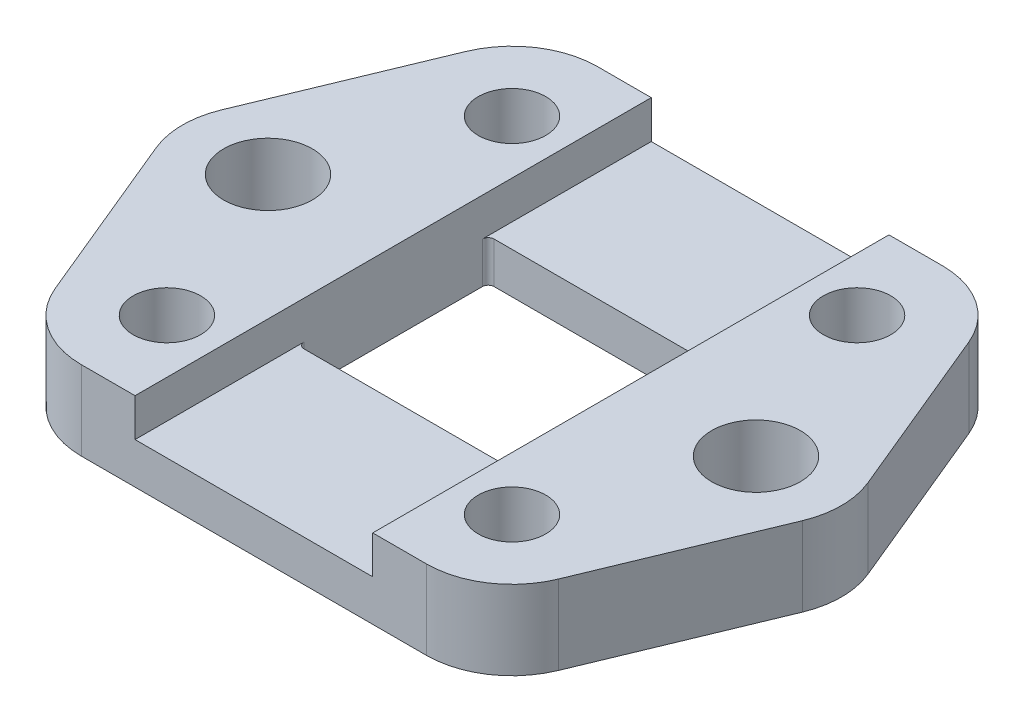
ISO-10303-21;
HEADER;
FILE_DESCRIPTION(('STEP AP214'),'2;1');
FILE_NAME('part.step','',(''),(''),'','','');
FILE_SCHEMA(('AUTOMOTIVE_DESIGN { 1 0 10303 214 1 1 1 1 }'));
ENDSEC;
DATA;
#1=APPLICATION_CONTEXT('core data for automotive mechanical design processes');
#2=APPLICATION_PROTOCOL_DEFINITION('international standard','automotive_design',2000,#1);
#3=PRODUCT_CONTEXT('',#1,'mechanical');
#4=PRODUCT('Part','Part','',(#3));
#5=PRODUCT_RELATED_PRODUCT_CATEGORY('part','',(#4));
#6=PRODUCT_DEFINITION_FORMATION('','',#4);
#7=PRODUCT_DEFINITION_CONTEXT('part definition',#1,'design');
#8=PRODUCT_DEFINITION('design','',#6,#7);
#9=PRODUCT_DEFINITION_SHAPE('','',#8);
#10=(LENGTH_UNIT() NAMED_UNIT(*) SI_UNIT(.MILLI.,.METRE.));
#11=(NAMED_UNIT(*) PLANE_ANGLE_UNIT() SI_UNIT($,.RADIAN.));
#12=(NAMED_UNIT(*) SI_UNIT($,.STERADIAN.) SOLID_ANGLE_UNIT());
#13=UNCERTAINTY_MEASURE_WITH_UNIT(LENGTH_MEASURE(1.E-05),#10,'distance_accuracy_value','');
#14=(GEOMETRIC_REPRESENTATION_CONTEXT(3) GLOBAL_UNCERTAINTY_ASSIGNED_CONTEXT((#13)) GLOBAL_UNIT_ASSIGNED_CONTEXT((#10,
#11,#12)) REPRESENTATION_CONTEXT('',''));
#15=CARTESIAN_POINT('',(0.,0.,0.));
#16=DIRECTION('',(0.,0.,1.));
#17=DIRECTION('',(1.,0.,0.));
#18=AXIS2_PLACEMENT_3D('',#15,#16,#17);
#19=CARTESIAN_POINT('',(0.,1.651,0.));
#20=DIRECTION('',(0.,1.,0.));
#21=DIRECTION('',(0.,0.,1.));
#22=AXIS2_PLACEMENT_3D('',#19,#20,#21);
#23=PLANE('',#22);
#24=DIRECTION('',(-1.,0.,0.));
#25=VECTOR('',#24,1.);
#26=CARTESIAN_POINT('',(9.2058356335816,1.651,-10.3441500000008));
#27=LINE('',#26,#25);
#28=CARTESIAN_POINT('',(4.7625,1.651,-10.3441500000008));
#29=VERTEX_POINT('',#28);
#30=CARTESIAN_POINT('',(-4.7625,1.651,-10.3441500000008));
#31=VERTEX_POINT('',#30);
#32=EDGE_CURVE('E254',#29,#31,#27,.T.);
#33=ORIENTED_EDGE('',*,*,#32,.T.);
#34=DIRECTION('',(0.,0.,-1.));
#35=VECTOR('',#34,1.);
#36=CARTESIAN_POINT('',(-4.7625,1.651,-10.3441500000008));
#37=LINE('',#36,#35);
#38=CARTESIAN_POINT('',(-4.7625,1.651,-3.57505));
#39=VERTEX_POINT('',#38);
#40=EDGE_CURVE('E211',#39,#31,#37,.T.);
#41=ORIENTED_EDGE('',*,*,#40,.F.);
#42=CARTESIAN_POINT('',(-4.52628,1.651,-3.57505));
#43=DIRECTION('',(0.,1.,0.));
#44=DIRECTION('',(0.,0.,1.));
#45=AXIS2_PLACEMENT_3D('',#42,#43,#44);
#46=CIRCLE('',#45,0.23622);
#47=CARTESIAN_POINT('',(-4.52628,1.651,-3.81127));
#48=VERTEX_POINT('',#47);
#49=EDGE_CURVE('E301',#39,#48,#46,.F.);
#50=ORIENTED_EDGE('',*,*,#49,.T.);
#51=DIRECTION('',(1.,0.,0.));
#52=VECTOR('',#51,1.);
#53=CARTESIAN_POINT('',(-4.7625,1.651,-3.81127));
#54=LINE('',#53,#52);
#55=CARTESIAN_POINT('',(4.52628,1.651,-3.81127));
#56=VERTEX_POINT('',#55);
#57=EDGE_CURVE('E265',#48,#56,#54,.T.);
#58=ORIENTED_EDGE('',*,*,#57,.T.);
#59=CARTESIAN_POINT('',(4.52628,1.651,-3.57505));
#60=DIRECTION('',(0.,1.,0.));
#61=DIRECTION('',(0.,0.,1.));
#62=AXIS2_PLACEMENT_3D('',#59,#60,#61);
#63=CIRCLE('',#62,0.23622);
#64=CARTESIAN_POINT('',(4.7625,1.651,-3.57505));
#65=VERTEX_POINT('',#64);
#66=EDGE_CURVE('E296',#56,#65,#63,.F.);
#67=ORIENTED_EDGE('',*,*,#66,.T.);
#68=DIRECTION('',(0.,0.,1.));
#69=VECTOR('',#68,1.);
#70=CARTESIAN_POINT('',(4.7625,1.651,4.55827593679038));
#71=LINE('',#70,#69);
#72=EDGE_CURVE('E233',#29,#65,#71,.T.);
#73=ORIENTED_EDGE('',*,*,#72,.F.);
#74=EDGE_LOOP('',(#33,#41,#50,#58,#67,#73));
#75=FACE_BOUND('',#74,.T.);
#76=ADVANCED_FACE('F33',(#75),#23,.T.);
#77=CARTESIAN_POINT('',(4.7625,1.651,3.57505));
#78=VERTEX_POINT('',#77);
#79=CARTESIAN_POINT('',(4.7625,1.651,10.3441499999993));
#80=VERTEX_POINT('',#79);
#81=EDGE_CURVE('E248',#78,#80,#71,.T.);
#82=ORIENTED_EDGE('',*,*,#81,.F.);
#83=CARTESIAN_POINT('',(4.52628,1.651,3.57505));
#84=DIRECTION('',(0.,1.,0.));
#85=DIRECTION('',(0.,0.,1.));
#86=AXIS2_PLACEMENT_3D('',#83,#84,#85);
#87=CIRCLE('',#86,0.23622);
#88=CARTESIAN_POINT('',(4.52628,1.651,3.81127));
#89=VERTEX_POINT('',#88);
#90=EDGE_CURVE('E292',#78,#89,#87,.F.);
#91=ORIENTED_EDGE('',*,*,#90,.T.);
#92=DIRECTION('',(-1.,0.,0.));
#93=VECTOR('',#92,1.);
#94=CARTESIAN_POINT('',(4.7625,1.651,3.81127));
#95=LINE('',#94,#93);
#96=CARTESIAN_POINT('',(-4.52628,1.651,3.81127));
#97=VERTEX_POINT('',#96);
#98=EDGE_CURVE('E261',#89,#97,#95,.T.);
#99=ORIENTED_EDGE('',*,*,#98,.T.);
#100=CARTESIAN_POINT('',(-4.52628,1.651,3.57505));
#101=DIRECTION('',(0.,1.,0.));
#102=DIRECTION('',(0.,0.,1.));
#103=AXIS2_PLACEMENT_3D('',#100,#101,#102);
#104=CIRCLE('',#103,0.23622);
#105=CARTESIAN_POINT('',(-4.7625,1.651,3.57505));
#106=VERTEX_POINT('',#105);
#107=EDGE_CURVE('E305',#97,#106,#104,.F.);
#108=ORIENTED_EDGE('',*,*,#107,.T.);
#109=CARTESIAN_POINT('',(-4.7625,1.651,10.3441499999992));
#110=VERTEX_POINT('',#109);
#111=EDGE_CURVE('E228',#110,#106,#37,.T.);
#112=ORIENTED_EDGE('',*,*,#111,.F.);
#113=DIRECTION('',(1.,0.,0.));
#114=VECTOR('',#113,1.);
#115=CARTESIAN_POINT('',(0.,1.651,10.3441499999993));
#116=LINE('',#115,#114);
#117=EDGE_CURVE('E389',#110,#80,#116,.T.);
#118=ORIENTED_EDGE('',*,*,#117,.T.);
#119=EDGE_LOOP('',(#82,#91,#99,#108,#112,#118));
#120=FACE_BOUND('',#119,.T.);
#121=ADVANCED_FACE('F462',(#120),#23,.T.);
#122=CARTESIAN_POINT('',(13.0190176059878,0.,1.13831436641802));
#123=DIRECTION('',(0.923879532511309,0.,0.382683432365037));
#124=DIRECTION('',(0.382683432365037,0.,-0.923879532511309));
#125=AXIS2_PLACEMENT_3D('',#122,#123,#124);
#126=PLANE('',#125);
#127=DIRECTION('',(0.382683432365037,0.,-0.923879532511309));
#128=VECTOR('',#127,1.);
#129=CARTESIAN_POINT('',(13.0190176059878,0.,1.13831436641802));
#130=LINE('',#129,#128);
#131=CARTESIAN_POINT('',(10.0826340011374,0.,8.22737148957899));
#132=VERTEX_POINT('',#131);
#133=CARTESIAN_POINT('',(12.946982916981,0.,1.31222148957968));
#134=VERTEX_POINT('',#133);
#135=EDGE_CURVE('E386',#132,#134,#130,.T.);
#136=ORIENTED_EDGE('',*,*,#135,.T.);
#137=DIRECTION('',(0.,1.,0.));
#138=VECTOR('',#137,1.);
#139=CARTESIAN_POINT('',(12.946982916981,0.,1.31222148957968));
#140=LINE('',#139,#138);
#141=CARTESIAN_POINT('',(12.946982916981,3.175,1.31222148957968));
#142=VERTEX_POINT('',#141);
#143=EDGE_CURVE('E310',#134,#142,#140,.T.);
#144=ORIENTED_EDGE('',*,*,#143,.T.);
#145=DIRECTION('',(0.382683432365037,0.,-0.923879532511309));
#146=VECTOR('',#145,1.);
#147=CARTESIAN_POINT('',(13.4905228548022,3.175,0.));
#148=LINE('',#147,#146);
#149=CARTESIAN_POINT('',(10.0826340011374,3.175,8.22737148957899));
#150=VERTEX_POINT('',#149);
#151=EDGE_CURVE('E236',#150,#142,#148,.T.);
#152=ORIENTED_EDGE('',*,*,#151,.F.);
#153=DIRECTION('',(0.,1.,0.));
#154=VECTOR('',#153,1.);
#155=CARTESIAN_POINT('',(10.0826340011374,0.,8.22737148957899));
#156=LINE('',#155,#154);
#157=EDGE_CURVE('E308',#150,#132,#156,.F.);
#158=ORIENTED_EDGE('',*,*,#157,.T.);
#159=EDGE_LOOP('',(#136,#144,#152,#158));
#160=FACE_BOUND('',#159,.T.);
#161=ADVANCED_FACE('F429',(#160),#126,.T.);
#162=CARTESIAN_POINT('',(-9.20583563358159,0.,10.3441499999992));
#163=DIRECTION('',(0.,0.,1.));
#164=DIRECTION('',(1.,0.,0.));
#165=AXIS2_PLACEMENT_3D('',#162,#163,#164);
#166=PLANE('',#165);
#167=DIRECTION('',(1.,0.,0.));
#168=VECTOR('',#167,1.);
#169=CARTESIAN_POINT('',(-9.20583563358159,3.175,10.3441499999992));
#170=LINE('',#169,#168);
#171=CARTESIAN_POINT('',(-6.91465108415632,3.175,10.3441499999992));
#172=VERTEX_POINT('',#171);
#173=CARTESIAN_POINT('',(-4.7625,3.175,10.3441499999992));
#174=VERTEX_POINT('',#173);
#175=EDGE_CURVE('E200',#172,#174,#170,.T.);
#176=ORIENTED_EDGE('',*,*,#175,.F.);
#177=DIRECTION('',(0.,1.,0.));
#178=VECTOR('',#177,1.);
#179=CARTESIAN_POINT('',(-6.91465108415632,0.,10.3441499999992));
#180=LINE('',#179,#178);
#181=CARTESIAN_POINT('',(-6.91465108415632,0.,10.3441499999992));
#182=VERTEX_POINT('',#181);
#183=EDGE_CURVE('E11',#172,#182,#180,.F.);
#184=ORIENTED_EDGE('',*,*,#183,.T.);
#185=DIRECTION('',(1.,0.,0.));
#186=VECTOR('',#185,1.);
#187=CARTESIAN_POINT('',(0.,0.,10.3441499999993));
#188=LINE('',#187,#186);
#189=CARTESIAN_POINT('',(6.91465108415613,0.,10.3441499999993));
#190=VERTEX_POINT('',#189);
#191=EDGE_CURVE('E253',#182,#190,#188,.T.);
#192=ORIENTED_EDGE('',*,*,#191,.T.);
#193=DIRECTION('',(0.,1.,0.));
#194=VECTOR('',#193,1.);
#195=CARTESIAN_POINT('',(6.91465108415613,0.,10.3441499999993));
#196=LINE('',#195,#194);
#197=CARTESIAN_POINT('',(6.91465108415613,3.175,10.3441499999993));
#198=VERTEX_POINT('',#197);
#199=EDGE_CURVE('E41',#190,#198,#196,.T.);
#200=ORIENTED_EDGE('',*,*,#199,.T.);
#201=DIRECTION('',(1.,0.,0.));
#202=VECTOR('',#201,1.);
#203=CARTESIAN_POINT('',(0.,3.175,10.3441499999993));
#204=LINE('',#203,#202);
#205=CARTESIAN_POINT('',(4.7625,3.175,10.3441499999993));
#206=VERTEX_POINT('',#205);
#207=EDGE_CURVE('E235',#206,#198,#204,.T.);
#208=ORIENTED_EDGE('',*,*,#207,.F.);
#209=DIRECTION('',(0.,-1.,0.));
#210=VECTOR('',#209,1.);
#211=CARTESIAN_POINT('',(4.7625,1.651,10.3441499999993));
#212=LINE('',#211,#210);
#213=EDGE_CURVE('E242',#206,#80,#212,.T.);
#214=ORIENTED_EDGE('',*,*,#213,.T.);
#215=ORIENTED_EDGE('',*,*,#117,.F.);
#216=DIRECTION('',(0.,-1.,0.));
#217=VECTOR('',#216,1.);
#218=CARTESIAN_POINT('',(-4.7625,0.,10.3441499999992));
#219=LINE('',#218,#217);
#220=EDGE_CURVE('E214',#174,#110,#219,.T.);
#221=ORIENTED_EDGE('',*,*,#220,.F.);
#222=EDGE_LOOP('',(#176,#184,#192,#200,#208,#214,#215,#221));
#223=FACE_BOUND('',#222,.T.);
#224=ADVANCED_FACE('F357',(#223),#166,.T.);
#225=CARTESIAN_POINT('',(-13.4905228548029,0.,0.));
#226=DIRECTION('',(-0.923879532511288,0.,0.382683432365088));
#227=DIRECTION('',(0.382683432365088,0.,0.923879532511288));
#228=AXIS2_PLACEMENT_3D('',#225,#226,#227);
#229=PLANE('',#228);
#230=DIRECTION('',(0.382683432365088,0.,0.923879532511288));
#231=VECTOR('',#230,1.);
#232=CARTESIAN_POINT('',(-13.4905228548029,0.,0.));
#233=LINE('',#232,#231);
#234=CARTESIAN_POINT('',(-12.9469829169815,0.,1.31222148957983));
#235=VERTEX_POINT('',#234);
#236=CARTESIAN_POINT('',(-10.0826340011375,0.,8.22737148957912));
#237=VERTEX_POINT('',#236);
#238=EDGE_CURVE('E371',#235,#237,#233,.T.);
#239=ORIENTED_EDGE('',*,*,#238,.T.);
#240=DIRECTION('',(0.,1.,0.));
#241=VECTOR('',#240,1.);
#242=CARTESIAN_POINT('',(-10.0826340011375,0.,8.22737148957912));
#243=LINE('',#242,#241);
#244=CARTESIAN_POINT('',(-10.0826340011375,3.175,8.22737148957912));
#245=VERTEX_POINT('',#244);
#246=EDGE_CURVE('E350',#237,#245,#243,.T.);
#247=ORIENTED_EDGE('',*,*,#246,.T.);
#248=DIRECTION('',(0.382683432365088,0.,0.923879532511288));
#249=VECTOR('',#248,1.);
#250=CARTESIAN_POINT('',(-9.20583563358159,3.175,10.3441499999992));
#251=LINE('',#250,#249);
#252=CARTESIAN_POINT('',(-12.9469829169815,3.175,1.31222148957982));
#253=VERTEX_POINT('',#252);
#254=EDGE_CURVE('E215',#253,#245,#251,.T.);
#255=ORIENTED_EDGE('',*,*,#254,.F.);
#256=DIRECTION('',(0.,1.,0.));
#257=VECTOR('',#256,1.);
#258=CARTESIAN_POINT('',(-12.9469829169815,0.,1.31222148957983));
#259=LINE('',#258,#257);
#260=EDGE_CURVE('E348',#253,#235,#259,.F.);
#261=ORIENTED_EDGE('',*,*,#260,.T.);
#262=EDGE_LOOP('',(#239,#247,#255,#261));
#263=FACE_BOUND('',#262,.T.);
#264=ADVANCED_FACE('F434',(#263),#229,.T.);
#265=CARTESIAN_POINT('',(-9.20583563358159,0.,-10.3441500000008));
#266=DIRECTION('',(-0.923879532511309,0.,-0.382683432365036));
#267=DIRECTION('',(-0.382683432365036,0.,0.923879532511309));
#268=AXIS2_PLACEMENT_3D('',#265,#266,#267);
#269=PLANE('',#268);
#270=DIRECTION('',(-0.382683432365036,0.,0.923879532511309));
#271=VECTOR('',#270,1.);
#272=CARTESIAN_POINT('',(-13.4905228548029,3.175,0.));
#273=LINE('',#272,#271);
#274=CARTESIAN_POINT('',(-10.0826340011374,3.175,-8.22737148958049));
#275=VERTEX_POINT('',#274);
#276=CARTESIAN_POINT('',(-12.9469829169816,3.175,-1.31222148957977));
#277=VERTEX_POINT('',#276);
#278=EDGE_CURVE('E222',#275,#277,#273,.T.);
#279=ORIENTED_EDGE('',*,*,#278,.F.);
#280=DIRECTION('',(0.,1.,0.));
#281=VECTOR('',#280,1.);
#282=CARTESIAN_POINT('',(-10.0826340011374,0.,-8.22737148958048));
#283=LINE('',#282,#281);
#284=CARTESIAN_POINT('',(-10.0826340011374,0.,-8.22737148958048));
#285=VERTEX_POINT('',#284);
#286=EDGE_CURVE('E346',#275,#285,#283,.F.);
#287=ORIENTED_EDGE('',*,*,#286,.T.);
#288=DIRECTION('',(-0.382683432365036,0.,0.923879532511309));
#289=VECTOR('',#288,1.);
#290=CARTESIAN_POINT('',(-9.20583563358159,0.,-10.3441500000008));
#291=LINE('',#290,#289);
#292=CARTESIAN_POINT('',(-12.9469829169816,0.,-1.31222148957977));
#293=VERTEX_POINT('',#292);
#294=EDGE_CURVE('E373',#285,#293,#291,.T.);
#295=ORIENTED_EDGE('',*,*,#294,.T.);
#296=DIRECTION('',(0.,1.,0.));
#297=VECTOR('',#296,1.);
#298=CARTESIAN_POINT('',(-12.9469829169816,0.,-1.31222148957977));
#299=LINE('',#298,#297);
#300=EDGE_CURVE('E343',#293,#277,#299,.T.);
#301=ORIENTED_EDGE('',*,*,#300,.T.);
#302=EDGE_LOOP('',(#279,#287,#295,#301));
#303=FACE_BOUND('',#302,.T.);
#304=ADVANCED_FACE('F489',(#303),#269,.T.);
#305=CARTESIAN_POINT('',(9.2058356335816,0.,-10.3441500000008));
#306=DIRECTION('',(0.,0.,-1.));
#307=DIRECTION('',(-1.,0.,0.));
#308=AXIS2_PLACEMENT_3D('',#305,#306,#307);
#309=PLANE('',#308);
#310=DIRECTION('',(-1.,0.,0.));
#311=VECTOR('',#310,1.);
#312=CARTESIAN_POINT('',(9.2058356335816,0.,-10.3441500000008));
#313=LINE('',#312,#311);
#314=CARTESIAN_POINT('',(6.91465108415603,0.,-10.3441500000008));
#315=VERTEX_POINT('',#314);
#316=CARTESIAN_POINT('',(-6.91465108415617,0.,-10.3441500000008));
#317=VERTEX_POINT('',#316);
#318=EDGE_CURVE('E378',#315,#317,#313,.T.);
#319=ORIENTED_EDGE('',*,*,#318,.T.);
#320=DIRECTION('',(0.,1.,0.));
#321=VECTOR('',#320,1.);
#322=CARTESIAN_POINT('',(-6.91465108415617,0.,-10.3441500000008));
#323=LINE('',#322,#321);
#324=CARTESIAN_POINT('',(-6.91465108415617,3.175,-10.3441500000008));
#325=VERTEX_POINT('',#324);
#326=EDGE_CURVE('E221',#317,#325,#323,.T.);
#327=ORIENTED_EDGE('',*,*,#326,.T.);
#328=DIRECTION('',(-1.,0.,0.));
#329=VECTOR('',#328,1.);
#330=CARTESIAN_POINT('',(-9.20583563358159,3.175,-10.3441500000008));
#331=LINE('',#330,#329);
#332=CARTESIAN_POINT('',(-4.7625,3.175,-10.3441500000008));
#333=VERTEX_POINT('',#332);
#334=EDGE_CURVE('E198',#333,#325,#331,.T.);
#335=ORIENTED_EDGE('',*,*,#334,.F.);
#336=DIRECTION('',(0.,-1.,0.));
#337=VECTOR('',#336,1.);
#338=CARTESIAN_POINT('',(-4.7625,3.175,-10.3441500000008));
#339=LINE('',#338,#337);
#340=EDGE_CURVE('E207',#333,#31,#339,.T.);
#341=ORIENTED_EDGE('',*,*,#340,.T.);
#342=ORIENTED_EDGE('',*,*,#32,.F.);
#343=DIRECTION('',(0.,-1.,0.));
#344=VECTOR('',#343,1.);
#345=CARTESIAN_POINT('',(4.7625,3.175,-10.3441500000008));
#346=LINE('',#345,#344);
#347=CARTESIAN_POINT('',(4.7625,3.175,-10.3441500000008));
#348=VERTEX_POINT('',#347);
#349=EDGE_CURVE('E398',#348,#29,#346,.T.);
#350=ORIENTED_EDGE('',*,*,#349,.F.);
#351=DIRECTION('',(-1.,0.,0.));
#352=VECTOR('',#351,1.);
#353=CARTESIAN_POINT('',(4.7625,3.175,-10.3441500000008));
#354=LINE('',#353,#352);
#355=CARTESIAN_POINT('',(6.91465108415603,3.175,-10.3441500000008));
#356=VERTEX_POINT('',#355);
#357=EDGE_CURVE('E230',#356,#348,#354,.T.);
#358=ORIENTED_EDGE('',*,*,#357,.F.);
#359=DIRECTION('',(0.,1.,0.));
#360=VECTOR('',#359,1.);
#361=CARTESIAN_POINT('',(6.91465108415603,0.,-10.3441500000008));
#362=LINE('',#361,#360);
#363=EDGE_CURVE('E336',#356,#315,#362,.F.);
#364=ORIENTED_EDGE('',*,*,#363,.T.);
#365=EDGE_LOOP('',(#319,#327,#335,#341,#342,#350,#358,#364));
#366=FACE_BOUND('',#365,.T.);
#367=ADVANCED_FACE('F219',(#366),#309,.T.);
#368=CARTESIAN_POINT('',(13.4905228548022,0.,0.));
#369=DIRECTION('',(0.923879532511331,0.,-0.382683432364982));
#370=DIRECTION('',(-0.382683432364982,0.,-0.923879532511331));
#371=AXIS2_PLACEMENT_3D('',#368,#369,#370);
#372=PLANE('',#371);
#373=DIRECTION('',(-0.382683432364982,0.,-0.923879532511331));
#374=VECTOR('',#373,1.);
#375=CARTESIAN_POINT('',(9.2058356335816,3.175,-10.3441500000008));
#376=LINE('',#375,#374);
#377=CARTESIAN_POINT('',(12.9469829169811,3.175,-1.31222148957956));
#378=VERTEX_POINT('',#377);
#379=CARTESIAN_POINT('',(10.0826340011374,3.175,-8.2273714895803));
#380=VERTEX_POINT('',#379);
#381=EDGE_CURVE('E239',#378,#380,#376,.T.);
#382=ORIENTED_EDGE('',*,*,#381,.F.);
#383=DIRECTION('',(0.,1.,0.));
#384=VECTOR('',#383,1.);
#385=CARTESIAN_POINT('',(12.9469829169811,0.,-1.31222148957956));
#386=LINE('',#385,#384);
#387=CARTESIAN_POINT('',(12.9469829169811,0.,-1.31222148957956));
#388=VERTEX_POINT('',#387);
#389=EDGE_CURVE('E322',#378,#388,#386,.F.);
#390=ORIENTED_EDGE('',*,*,#389,.T.);
#391=DIRECTION('',(-0.382683432364982,0.,-0.923879532511331));
#392=VECTOR('',#391,1.);
#393=CARTESIAN_POINT('',(13.4905228548022,0.,0.));
#394=LINE('',#393,#392);
#395=CARTESIAN_POINT('',(10.0826340011374,0.,-8.2273714895803));
#396=VERTEX_POINT('',#395);
#397=EDGE_CURVE('E383',#388,#396,#394,.T.);
#398=ORIENTED_EDGE('',*,*,#397,.T.);
#399=DIRECTION('',(0.,1.,0.));
#400=VECTOR('',#399,1.);
#401=CARTESIAN_POINT('',(10.0826340011374,0.,-8.2273714895803));
#402=LINE('',#401,#400);
#403=EDGE_CURVE('E319',#396,#380,#402,.T.);
#404=ORIENTED_EDGE('',*,*,#403,.T.);
#405=EDGE_LOOP('',(#382,#390,#398,#404));
#406=FACE_BOUND('',#405,.T.);
#407=ADVANCED_FACE('F422',(#406),#372,.T.);
#408=CARTESIAN_POINT('',(0.,0.,0.));
#409=DIRECTION('',(0.,1.,0.));
#410=DIRECTION('',(0.,0.,1.));
#411=AXIS2_PLACEMENT_3D('',#408,#409,#410);
#412=PLANE('',#411);
#413=CARTESIAN_POINT('',(9.779,0.,0.));
#414=DIRECTION('',(0.,1.,0.));
#415=DIRECTION('',(0.,0.,1.));
#416=AXIS2_PLACEMENT_3D('',#413,#414,#415);
#417=CIRCLE('',#416,1.77799999999998);
#418=CARTESIAN_POINT('',(9.779,0.,1.77799999999998));
#419=VERTEX_POINT('',#418);
#420=EDGE_CURVE('E781',#419,#419,#417,.T.);
#421=ORIENTED_EDGE('',*,*,#420,.T.);
#422=EDGE_LOOP('',(#421));
#423=FACE_BOUND('',#422,.T.);
#424=CARTESIAN_POINT('',(-9.779,0.,0.));
#425=DIRECTION('',(0.,1.,0.));
#426=DIRECTION('',(0.,0.,1.));
#427=AXIS2_PLACEMENT_3D('',#424,#425,#426);
#428=CIRCLE('',#427,1.77799999999998);
#429=CARTESIAN_POINT('',(-9.779,0.,1.77799999999998));
#430=VERTEX_POINT('',#429);
#431=EDGE_CURVE('E774',#430,#430,#428,.T.);
#432=ORIENTED_EDGE('',*,*,#431,.T.);
#433=EDGE_LOOP('',(#432));
#434=FACE_BOUND('',#433,.T.);
#435=CARTESIAN_POINT('',(6.91479721322323,0.,-6.91479721322326));
#436=DIRECTION('',(0.,1.,0.));
#437=DIRECTION('',(0.,0.,1.));
#438=AXIS2_PLACEMENT_3D('',#435,#436,#437);
#439=CIRCLE('',#438,1.35254999999998);
#440=CARTESIAN_POINT('',(6.91479721322323,0.,-5.56224721322328));
#441=VERTEX_POINT('',#440);
#442=EDGE_CURVE('E779',#441,#441,#439,.T.);
#443=ORIENTED_EDGE('',*,*,#442,.T.);
#444=EDGE_LOOP('',(#443));
#445=FACE_BOUND('',#444,.T.);
#446=CARTESIAN_POINT('',(-6.91479721322329,0.,-6.91479721322321));
#447=DIRECTION('',(0.,1.,0.));
#448=DIRECTION('',(0.,0.,1.));
#449=AXIS2_PLACEMENT_3D('',#446,#447,#448);
#450=CIRCLE('',#449,1.35254999999998);
#451=CARTESIAN_POINT('',(-6.91479721322329,0.,-5.56224721322323));
#452=VERTEX_POINT('',#451);
#453=EDGE_CURVE('E790',#452,#452,#450,.T.);
#454=ORIENTED_EDGE('',*,*,#453,.T.);
#455=EDGE_LOOP('',(#454));
#456=FACE_BOUND('',#455,.T.);
#457=CARTESIAN_POINT('',(-6.91479721322323,0.,6.91479721322326));
#458=DIRECTION('',(0.,1.,0.));
#459=DIRECTION('',(0.,0.,1.));
#460=AXIS2_PLACEMENT_3D('',#457,#458,#459);
#461=CIRCLE('',#460,1.35254999999998);
#462=CARTESIAN_POINT('',(-6.91479721322323,0.,8.26734721322324));
#463=VERTEX_POINT('',#462);
#464=EDGE_CURVE('E796',#463,#463,#461,.T.);
#465=ORIENTED_EDGE('',*,*,#464,.T.);
#466=EDGE_LOOP('',(#465));
#467=FACE_BOUND('',#466,.T.);
#468=CARTESIAN_POINT('',(6.91479721322329,0.,6.91479721322321));
#469=DIRECTION('',(0.,1.,0.));
#470=DIRECTION('',(0.,0.,1.));
#471=AXIS2_PLACEMENT_3D('',#468,#469,#470);
#472=CIRCLE('',#471,1.35254999999998);
#473=CARTESIAN_POINT('',(6.91479721322329,0.,8.26734721322319));
#474=VERTEX_POINT('',#473);
#475=EDGE_CURVE('E801',#474,#474,#472,.T.);
#476=ORIENTED_EDGE('',*,*,#475,.T.);
#477=EDGE_LOOP('',(#476));
#478=FACE_BOUND('',#477,.T.);
#479=DIRECTION('',(1.,0.,0.));
#480=VECTOR('',#479,1.);
#481=CARTESIAN_POINT('',(-4.7625,0.,-3.81127));
#482=LINE('',#481,#480);
#483=CARTESIAN_POINT('',(-4.52628,0.,-3.81127));
#484=VERTEX_POINT('',#483);
#485=CARTESIAN_POINT('',(4.52628,0.,-3.81127));
#486=VERTEX_POINT('',#485);
#487=EDGE_CURVE('E395',#484,#486,#482,.T.);
#488=ORIENTED_EDGE('',*,*,#487,.F.);
#489=CARTESIAN_POINT('',(-4.52628,0.,-3.57505));
#490=DIRECTION('',(0.,1.,0.));
#491=DIRECTION('',(0.,0.,1.));
#492=AXIS2_PLACEMENT_3D('',#489,#490,#491);
#493=CIRCLE('',#492,0.23622);
#494=CARTESIAN_POINT('',(-4.7625,0.,-3.57505));
#495=VERTEX_POINT('',#494);
#496=EDGE_CURVE('E299',#484,#495,#493,.T.);
#497=ORIENTED_EDGE('',*,*,#496,.T.);
#498=DIRECTION('',(0.,0.,-1.));
#499=VECTOR('',#498,1.);
#500=CARTESIAN_POINT('',(-4.7625,0.,3.81127));
#501=LINE('',#500,#499);
#502=CARTESIAN_POINT('',(-4.7625,0.,3.57505));
#503=VERTEX_POINT('',#502);
#504=EDGE_CURVE('E397',#503,#495,#501,.T.);
#505=ORIENTED_EDGE('',*,*,#504,.F.);
#506=CARTESIAN_POINT('',(-4.52628,0.,3.57505));
#507=DIRECTION('',(0.,1.,0.));
#508=DIRECTION('',(0.,0.,1.));
#509=AXIS2_PLACEMENT_3D('',#506,#507,#508);
#510=CIRCLE('',#509,0.23622);
#511=CARTESIAN_POINT('',(-4.52628,0.,3.81127));
#512=VERTEX_POINT('',#511);
#513=EDGE_CURVE('E303',#503,#512,#510,.T.);
#514=ORIENTED_EDGE('',*,*,#513,.T.);
#515=DIRECTION('',(-1.,0.,0.));
#516=VECTOR('',#515,1.);
#517=CARTESIAN_POINT('',(4.7625,0.,3.81127));
#518=LINE('',#517,#516);
#519=CARTESIAN_POINT('',(4.52628,0.,3.81127));
#520=VERTEX_POINT('',#519);
#521=EDGE_CURVE('E280',#520,#512,#518,.T.);
#522=ORIENTED_EDGE('',*,*,#521,.F.);
#523=CARTESIAN_POINT('',(4.52628,0.,3.57505));
#524=DIRECTION('',(0.,1.,0.));
#525=DIRECTION('',(0.,0.,1.));
#526=AXIS2_PLACEMENT_3D('',#523,#524,#525);
#527=CIRCLE('',#526,0.23622);
#528=CARTESIAN_POINT('',(4.7625,0.,3.57505));
#529=VERTEX_POINT('',#528);
#530=EDGE_CURVE('E290',#520,#529,#527,.T.);
#531=ORIENTED_EDGE('',*,*,#530,.T.);
#532=DIRECTION('',(0.,0.,1.));
#533=VECTOR('',#532,1.);
#534=CARTESIAN_POINT('',(4.7625,0.,-3.81127));
#535=LINE('',#534,#533);
#536=CARTESIAN_POINT('',(4.7625,0.,-3.57505));
#537=VERTEX_POINT('',#536);
#538=EDGE_CURVE('E392',#537,#529,#535,.T.);
#539=ORIENTED_EDGE('',*,*,#538,.F.);
#540=CARTESIAN_POINT('',(4.52628,0.,-3.57505));
#541=DIRECTION('',(0.,1.,0.));
#542=DIRECTION('',(0.,0.,1.));
#543=AXIS2_PLACEMENT_3D('',#540,#541,#542);
#544=CIRCLE('',#543,0.23622);
#545=EDGE_CURVE('E294',#537,#486,#544,.T.);
#546=ORIENTED_EDGE('',*,*,#545,.T.);
#547=EDGE_LOOP('',(#488,#497,#505,#514,#522,#531,#539,#546));
#548=FACE_BOUND('',#547,.T.);
#549=ORIENTED_EDGE('',*,*,#397,.F.);
#550=CARTESIAN_POINT('',(9.7789999999997,0.,0.));
#551=DIRECTION('',(0.,1.,0.));
#552=DIRECTION('',(0.,0.,1.));
#553=AXIS2_PLACEMENT_3D('',#550,#551,#552);
#554=CIRCLE('',#553,3.429);
#555=EDGE_CURVE('E334',#388,#134,#554,.F.);
#556=ORIENTED_EDGE('',*,*,#555,.T.);
#557=ORIENTED_EDGE('',*,*,#135,.F.);
#558=CARTESIAN_POINT('',(6.91465108415614,0.,6.91514999999927));
#559=DIRECTION('',(0.,1.,0.));
#560=DIRECTION('',(0.,0.,1.));
#561=AXIS2_PLACEMENT_3D('',#558,#559,#560);
#562=CIRCLE('',#561,3.429);
#563=EDGE_CURVE('E326',#132,#190,#562,.F.);
#564=ORIENTED_EDGE('',*,*,#563,.T.);
#565=ORIENTED_EDGE('',*,*,#191,.F.);
#566=CARTESIAN_POINT('',(-6.91465108415631,0.,6.91514999999923));
#567=DIRECTION('',(0.,1.,0.));
#568=DIRECTION('',(0.,0.,1.));
#569=AXIS2_PLACEMENT_3D('',#566,#567,#568);
#570=CIRCLE('',#569,3.429);
#571=EDGE_CURVE('E328',#182,#237,#570,.F.);
#572=ORIENTED_EDGE('',*,*,#571,.T.);
#573=ORIENTED_EDGE('',*,*,#238,.F.);
#574=CARTESIAN_POINT('',(-9.7790000000003,0.,0.));
#575=DIRECTION('',(0.,1.,0.));
#576=DIRECTION('',(0.,0.,1.));
#577=AXIS2_PLACEMENT_3D('',#574,#575,#576);
#578=CIRCLE('',#577,3.429);
#579=EDGE_CURVE('E324',#235,#293,#578,.F.);
#580=ORIENTED_EDGE('',*,*,#579,.T.);
#581=ORIENTED_EDGE('',*,*,#294,.F.);
#582=CARTESIAN_POINT('',(-6.91465108415617,0.,-6.91515000000078));
#583=DIRECTION('',(0.,1.,0.));
#584=DIRECTION('',(0.,0.,1.));
#585=AXIS2_PLACEMENT_3D('',#582,#583,#584);
#586=CIRCLE('',#585,3.429);
#587=EDGE_CURVE('E332',#285,#317,#586,.F.);
#588=ORIENTED_EDGE('',*,*,#587,.T.);
#589=ORIENTED_EDGE('',*,*,#318,.F.);
#590=CARTESIAN_POINT('',(6.91465108415603,0.,-6.91515000000078));
#591=DIRECTION('',(0.,1.,0.));
#592=DIRECTION('',(0.,0.,1.));
#593=AXIS2_PLACEMENT_3D('',#590,#591,#592);
#594=CIRCLE('',#593,3.429);
#595=EDGE_CURVE('E330',#315,#396,#594,.F.);
#596=ORIENTED_EDGE('',*,*,#595,.T.);
#597=EDGE_LOOP('',(#549,#556,#557,#564,#565,#572,#573,#580,#581,#588,#589,#596));
#598=FACE_BOUND('',#597,.T.);
#599=ADVANCED_FACE('F418',(#423,#434,#445,#456,#467,#478,#548,#598),#412,.F.);
#600=CARTESIAN_POINT('',(-4.7625,1.651,3.81127));
#601=DIRECTION('',(-1.,0.,0.));
#602=DIRECTION('',(0.,0.,1.));
#603=AXIS2_PLACEMENT_3D('',#600,#601,#602);
#604=PLANE('',#603);
#605=ORIENTED_EDGE('',*,*,#504,.T.);
#606=DIRECTION('',(0.,-1.,0.));
#607=VECTOR('',#606,1.);
#608=CARTESIAN_POINT('',(-4.7625,1.651,-3.57505));
#609=LINE('',#608,#607);
#610=EDGE_CURVE('E288',#495,#39,#609,.F.);
#611=ORIENTED_EDGE('',*,*,#610,.T.);
#612=ORIENTED_EDGE('',*,*,#40,.T.);
#613=ORIENTED_EDGE('',*,*,#340,.F.);
#614=DIRECTION('',(0.,0.,-1.));
#615=VECTOR('',#614,1.);
#616=CARTESIAN_POINT('',(-4.7625,3.175,-10.3441500000008));
#617=LINE('',#616,#615);
#618=EDGE_CURVE('E194',#174,#333,#617,.T.);
#619=ORIENTED_EDGE('',*,*,#618,.F.);
#620=ORIENTED_EDGE('',*,*,#220,.T.);
#621=ORIENTED_EDGE('',*,*,#111,.T.);
#622=DIRECTION('',(0.,-1.,0.));
#623=VECTOR('',#622,1.);
#624=CARTESIAN_POINT('',(-4.7625,0.,3.57505));
#625=LINE('',#624,#623);
#626=EDGE_CURVE('E285',#106,#503,#625,.T.);
#627=ORIENTED_EDGE('',*,*,#626,.T.);
#628=EDGE_LOOP('',(#605,#611,#612,#613,#619,#620,#621,#627));
#629=FACE_BOUND('',#628,.T.);
#630=ADVANCED_FACE('F209',(#629),#604,.F.);
#631=CARTESIAN_POINT('',(4.7625,1.651,3.81127));
#632=DIRECTION('',(0.,0.,1.));
#633=DIRECTION('',(1.,0.,0.));
#634=AXIS2_PLACEMENT_3D('',#631,#632,#633);
#635=PLANE('',#634);
#636=ORIENTED_EDGE('',*,*,#98,.F.);
#637=DIRECTION('',(0.,-1.,0.));
#638=VECTOR('',#637,1.);
#639=CARTESIAN_POINT('',(4.52628,0.,3.81127));
#640=LINE('',#639,#638);
#641=EDGE_CURVE('E268',#89,#520,#640,.T.);
#642=ORIENTED_EDGE('',*,*,#641,.T.);
#643=ORIENTED_EDGE('',*,*,#521,.T.);
#644=DIRECTION('',(0.,-1.,0.));
#645=VECTOR('',#644,1.);
#646=CARTESIAN_POINT('',(-4.52628,1.651,3.81127));
#647=LINE('',#646,#645);
#648=EDGE_CURVE('E252',#512,#97,#647,.F.);
#649=ORIENTED_EDGE('',*,*,#648,.T.);
#650=EDGE_LOOP('',(#636,#642,#643,#649));
#651=FACE_BOUND('',#650,.T.);
#652=ADVANCED_FACE('F458',(#651),#635,.F.);
#653=CARTESIAN_POINT('',(4.7625,1.651,-3.81127));
#654=DIRECTION('',(1.,0.,0.));
#655=DIRECTION('',(0.,0.,-1.));
#656=AXIS2_PLACEMENT_3D('',#653,#654,#655);
#657=PLANE('',#656);
#658=ORIENTED_EDGE('',*,*,#538,.T.);
#659=DIRECTION('',(0.,-1.,0.));
#660=VECTOR('',#659,1.);
#661=CARTESIAN_POINT('',(4.7625,1.651,3.57505));
#662=LINE('',#661,#660);
#663=EDGE_CURVE('E274',#529,#78,#662,.F.);
#664=ORIENTED_EDGE('',*,*,#663,.T.);
#665=ORIENTED_EDGE('',*,*,#81,.T.);
#666=ORIENTED_EDGE('',*,*,#213,.F.);
#667=DIRECTION('',(0.,0.,1.));
#668=VECTOR('',#667,1.);
#669=CARTESIAN_POINT('',(4.7625,3.175,4.55827593679038));
#670=LINE('',#669,#668);
#671=EDGE_CURVE('E232',#348,#206,#670,.T.);
#672=ORIENTED_EDGE('',*,*,#671,.F.);
#673=ORIENTED_EDGE('',*,*,#349,.T.);
#674=ORIENTED_EDGE('',*,*,#72,.T.);
#675=DIRECTION('',(0.,-1.,0.));
#676=VECTOR('',#675,1.);
#677=CARTESIAN_POINT('',(4.7625,0.,-3.57505));
#678=LINE('',#677,#676);
#679=EDGE_CURVE('E271',#65,#537,#678,.T.);
#680=ORIENTED_EDGE('',*,*,#679,.T.);
#681=EDGE_LOOP('',(#658,#664,#665,#666,#672,#673,#674,#680));
#682=FACE_BOUND('',#681,.T.);
#683=ADVANCED_FACE('F436',(#682),#657,.F.);
#684=CARTESIAN_POINT('',(-4.7625,1.651,-3.81127));
#685=DIRECTION('',(0.,0.,-1.));
#686=DIRECTION('',(-1.,0.,0.));
#687=AXIS2_PLACEMENT_3D('',#684,#685,#686);
#688=PLANE('',#687);
#689=ORIENTED_EDGE('',*,*,#487,.T.);
#690=DIRECTION('',(0.,-1.,0.));
#691=VECTOR('',#690,1.);
#692=CARTESIAN_POINT('',(4.52628,1.651,-3.81127));
#693=LINE('',#692,#691);
#694=EDGE_CURVE('E283',#486,#56,#693,.F.);
#695=ORIENTED_EDGE('',*,*,#694,.T.);
#696=ORIENTED_EDGE('',*,*,#57,.F.);
#697=DIRECTION('',(0.,-1.,0.));
#698=VECTOR('',#697,1.);
#699=CARTESIAN_POINT('',(-4.52628,0.,-3.81127));
#700=LINE('',#699,#698);
#701=EDGE_CURVE('E277',#48,#484,#700,.T.);
#702=ORIENTED_EDGE('',*,*,#701,.T.);
#703=EDGE_LOOP('',(#689,#695,#696,#702));
#704=FACE_BOUND('',#703,.T.);
#705=ADVANCED_FACE('F447',(#704),#688,.F.);
#706=CARTESIAN_POINT('',(0.,3.175,0.));
#707=DIRECTION('',(0.,1.,0.));
#708=DIRECTION('',(0.,0.,1.));
#709=AXIS2_PLACEMENT_3D('',#706,#707,#708);
#710=PLANE('',#709);
#711=CARTESIAN_POINT('',(9.779,3.175,0.));
#712=DIRECTION('',(0.,1.,0.));
#713=DIRECTION('',(0.,0.,1.));
#714=AXIS2_PLACEMENT_3D('',#711,#712,#713);
#715=CIRCLE('',#714,1.77799999999998);
#716=CARTESIAN_POINT('',(9.779,3.175,1.77799999999998));
#717=VERTEX_POINT('',#716);
#718=EDGE_CURVE('E823',#717,#717,#715,.T.);
#719=ORIENTED_EDGE('',*,*,#718,.F.);
#720=EDGE_LOOP('',(#719));
#721=FACE_BOUND('',#720,.T.);
#722=CARTESIAN_POINT('',(6.91479721322323,3.175,-6.91479721322326));
#723=DIRECTION('',(0.,1.,0.));
#724=DIRECTION('',(0.,0.,1.));
#725=AXIS2_PLACEMENT_3D('',#722,#723,#724);
#726=CIRCLE('',#725,1.35254999999998);
#727=CARTESIAN_POINT('',(6.91479721322323,3.175,-5.56224721322328));
#728=VERTEX_POINT('',#727);
#729=EDGE_CURVE('E776',#728,#728,#726,.T.);
#730=ORIENTED_EDGE('',*,*,#729,.F.);
#731=EDGE_LOOP('',(#730));
#732=FACE_BOUND('',#731,.T.);
#733=CARTESIAN_POINT('',(6.91479721322329,3.175,6.91479721322321));
#734=DIRECTION('',(0.,1.,0.));
#735=DIRECTION('',(0.,0.,1.));
#736=AXIS2_PLACEMENT_3D('',#733,#734,#735);
#737=CIRCLE('',#736,1.35254999999998);
#738=CARTESIAN_POINT('',(6.91479721322329,3.175,8.26734721322319));
#739=VERTEX_POINT('',#738);
#740=EDGE_CURVE('E799',#739,#739,#737,.T.);
#741=ORIENTED_EDGE('',*,*,#740,.F.);
#742=EDGE_LOOP('',(#741));
#743=FACE_BOUND('',#742,.T.);
#744=ORIENTED_EDGE('',*,*,#151,.T.);
#745=CARTESIAN_POINT('',(9.7789999999997,3.175,0.));
#746=DIRECTION('',(0.,1.,0.));
#747=DIRECTION('',(0.,0.,1.));
#748=AXIS2_PLACEMENT_3D('',#745,#746,#747);
#749=CIRCLE('',#748,3.429);
#750=EDGE_CURVE('E317',#142,#378,#749,.T.);
#751=ORIENTED_EDGE('',*,*,#750,.T.);
#752=ORIENTED_EDGE('',*,*,#381,.T.);
#753=CARTESIAN_POINT('',(6.91465108415603,3.175,-6.91515000000078));
#754=DIRECTION('',(0.,1.,0.));
#755=DIRECTION('',(0.,0.,1.));
#756=AXIS2_PLACEMENT_3D('',#753,#754,#755);
#757=CIRCLE('',#756,3.429);
#758=EDGE_CURVE('E315',#380,#356,#757,.T.);
#759=ORIENTED_EDGE('',*,*,#758,.T.);
#760=ORIENTED_EDGE('',*,*,#357,.T.);
#761=ORIENTED_EDGE('',*,*,#671,.T.);
#762=ORIENTED_EDGE('',*,*,#207,.T.);
#763=CARTESIAN_POINT('',(6.91465108415614,3.175,6.91514999999927));
#764=DIRECTION('',(0.,1.,0.));
#765=DIRECTION('',(0.,0.,1.));
#766=AXIS2_PLACEMENT_3D('',#763,#764,#765);
#767=CIRCLE('',#766,3.429);
#768=EDGE_CURVE('E313',#198,#150,#767,.T.);
#769=ORIENTED_EDGE('',*,*,#768,.T.);
#770=EDGE_LOOP('',(#744,#751,#752,#759,#760,#761,#762,#769));
#771=FACE_BOUND('',#770,.T.);
#772=ADVANCED_FACE('F363',(#721,#732,#743,#771),#710,.T.);
#773=CARTESIAN_POINT('',(0.,3.175,0.));
#774=DIRECTION('',(0.,-1.,0.));
#775=DIRECTION('',(0.,0.,-1.));
#776=AXIS2_PLACEMENT_3D('',#773,#774,#775);
#777=PLANE('',#776);
#778=CARTESIAN_POINT('',(-9.779,3.175,0.));
#779=DIRECTION('',(0.,1.,0.));
#780=DIRECTION('',(0.,0.,1.));
#781=AXIS2_PLACEMENT_3D('',#778,#779,#780);
#782=CIRCLE('',#781,1.77799999999998);
#783=CARTESIAN_POINT('',(-9.779,3.175,1.77799999999998));
#784=VERTEX_POINT('',#783);
#785=EDGE_CURVE('E771',#784,#784,#782,.T.);
#786=ORIENTED_EDGE('',*,*,#785,.F.);
#787=EDGE_LOOP('',(#786));
#788=FACE_BOUND('',#787,.T.);
#789=CARTESIAN_POINT('',(-6.91479721322329,3.175,-6.91479721322321));
#790=DIRECTION('',(0.,1.,0.));
#791=DIRECTION('',(0.,0.,1.));
#792=AXIS2_PLACEMENT_3D('',#789,#790,#791);
#793=CIRCLE('',#792,1.35254999999998);
#794=CARTESIAN_POINT('',(-6.91479721322329,3.175,-5.56224721322323));
#795=VERTEX_POINT('',#794);
#796=EDGE_CURVE('E787',#795,#795,#793,.T.);
#797=ORIENTED_EDGE('',*,*,#796,.F.);
#798=EDGE_LOOP('',(#797));
#799=FACE_BOUND('',#798,.T.);
#800=CARTESIAN_POINT('',(-6.91479721322323,3.175,6.91479721322326));
#801=DIRECTION('',(0.,1.,0.));
#802=DIRECTION('',(0.,0.,1.));
#803=AXIS2_PLACEMENT_3D('',#800,#801,#802);
#804=CIRCLE('',#803,1.35254999999998);
#805=CARTESIAN_POINT('',(-6.91479721322323,3.175,8.26734721322324));
#806=VERTEX_POINT('',#805);
#807=EDGE_CURVE('E793',#806,#806,#804,.T.);
#808=ORIENTED_EDGE('',*,*,#807,.F.);
#809=EDGE_LOOP('',(#808));
#810=FACE_BOUND('',#809,.T.);
#811=ORIENTED_EDGE('',*,*,#334,.T.);
#812=CARTESIAN_POINT('',(-6.91465108415617,3.175,-6.91515000000078));
#813=DIRECTION('',(0.,-1.,0.));
#814=DIRECTION('',(0.,0.,-1.));
#815=AXIS2_PLACEMENT_3D('',#812,#813,#814);
#816=CIRCLE('',#815,3.429);
#817=EDGE_CURVE('E341',#325,#275,#816,.F.);
#818=ORIENTED_EDGE('',*,*,#817,.T.);
#819=ORIENTED_EDGE('',*,*,#278,.T.);
#820=CARTESIAN_POINT('',(-9.7790000000003,3.175,0.));
#821=DIRECTION('',(0.,-1.,0.));
#822=DIRECTION('',(0.,0.,-1.));
#823=AXIS2_PLACEMENT_3D('',#820,#821,#822);
#824=CIRCLE('',#823,3.429);
#825=EDGE_CURVE('E56',#277,#253,#824,.F.);
#826=ORIENTED_EDGE('',*,*,#825,.T.);
#827=ORIENTED_EDGE('',*,*,#254,.T.);
#828=CARTESIAN_POINT('',(-6.91465108415631,3.175,6.91514999999923));
#829=DIRECTION('',(0.,-1.,0.));
#830=DIRECTION('',(0.,0.,-1.));
#831=AXIS2_PLACEMENT_3D('',#828,#829,#830);
#832=CIRCLE('',#831,3.429);
#833=EDGE_CURVE('E48',#245,#172,#832,.F.);
#834=ORIENTED_EDGE('',*,*,#833,.T.);
#835=ORIENTED_EDGE('',*,*,#175,.T.);
#836=ORIENTED_EDGE('',*,*,#618,.T.);
#837=EDGE_LOOP('',(#811,#818,#819,#826,#827,#834,#835,#836));
#838=FACE_BOUND('',#837,.T.);
#839=ADVANCED_FACE('F196',(#788,#799,#810,#838),#777,.F.);
#840=CARTESIAN_POINT('',(6.91479721322329,3.175,6.91479721322321));
#841=DIRECTION('',(0.,1.,0.));
#842=DIRECTION('',(0.,0.,1.));
#843=AXIS2_PLACEMENT_3D('',#840,#841,#842);
#844=CYLINDRICAL_SURFACE('',#843,1.35254999999998);
#845=ORIENTED_EDGE('',*,*,#740,.T.);
#846=EDGE_LOOP('',(#845));
#847=FACE_BOUND('',#846,.T.);
#848=ORIENTED_EDGE('',*,*,#475,.F.);
#849=EDGE_LOOP('',(#848));
#850=FACE_BOUND('',#849,.T.);
#851=ADVANCED_FACE('F562',(#847,#850),#844,.F.);
#852=CARTESIAN_POINT('',(-6.91479721322323,3.175,6.91479721322326));
#853=DIRECTION('',(0.,1.,0.));
#854=DIRECTION('',(0.,0.,1.));
#855=AXIS2_PLACEMENT_3D('',#852,#853,#854);
#856=CYLINDRICAL_SURFACE('',#855,1.35254999999998);
#857=ORIENTED_EDGE('',*,*,#807,.T.);
#858=EDGE_LOOP('',(#857));
#859=FACE_BOUND('',#858,.T.);
#860=ORIENTED_EDGE('',*,*,#464,.F.);
#861=EDGE_LOOP('',(#860));
#862=FACE_BOUND('',#861,.T.);
#863=ADVANCED_FACE('F571',(#859,#862),#856,.F.);
#864=CARTESIAN_POINT('',(-6.91479721322329,3.175,-6.91479721322321));
#865=DIRECTION('',(0.,1.,0.));
#866=DIRECTION('',(0.,0.,1.));
#867=AXIS2_PLACEMENT_3D('',#864,#865,#866);
#868=CYLINDRICAL_SURFACE('',#867,1.35254999999998);
#869=ORIENTED_EDGE('',*,*,#796,.T.);
#870=EDGE_LOOP('',(#869));
#871=FACE_BOUND('',#870,.T.);
#872=ORIENTED_EDGE('',*,*,#453,.F.);
#873=EDGE_LOOP('',(#872));
#874=FACE_BOUND('',#873,.T.);
#875=ADVANCED_FACE('F579',(#871,#874),#868,.F.);
#876=CARTESIAN_POINT('',(6.91479721322323,3.175,-6.91479721322326));
#877=DIRECTION('',(0.,1.,0.));
#878=DIRECTION('',(0.,0.,1.));
#879=AXIS2_PLACEMENT_3D('',#876,#877,#878);
#880=CYLINDRICAL_SURFACE('',#879,1.35254999999998);
#881=ORIENTED_EDGE('',*,*,#729,.T.);
#882=EDGE_LOOP('',(#881));
#883=FACE_BOUND('',#882,.T.);
#884=ORIENTED_EDGE('',*,*,#442,.F.);
#885=EDGE_LOOP('',(#884));
#886=FACE_BOUND('',#885,.T.);
#887=ADVANCED_FACE('F587',(#883,#886),#880,.F.);
#888=CARTESIAN_POINT('',(-9.779,3.175,0.));
#889=DIRECTION('',(0.,1.,0.));
#890=DIRECTION('',(0.,0.,1.));
#891=AXIS2_PLACEMENT_3D('',#888,#889,#890);
#892=CYLINDRICAL_SURFACE('',#891,1.77799999999998);
#893=ORIENTED_EDGE('',*,*,#785,.T.);
#894=EDGE_LOOP('',(#893));
#895=FACE_BOUND('',#894,.T.);
#896=ORIENTED_EDGE('',*,*,#431,.F.);
#897=EDGE_LOOP('',(#896));
#898=FACE_BOUND('',#897,.T.);
#899=ADVANCED_FACE('F475',(#895,#898),#892,.F.);
#900=CARTESIAN_POINT('',(9.779,3.175,0.));
#901=DIRECTION('',(0.,1.,0.));
#902=DIRECTION('',(0.,0.,1.));
#903=AXIS2_PLACEMENT_3D('',#900,#901,#902);
#904=CYLINDRICAL_SURFACE('',#903,1.77799999999998);
#905=ORIENTED_EDGE('',*,*,#718,.T.);
#906=EDGE_LOOP('',(#905));
#907=FACE_BOUND('',#906,.T.);
#908=ORIENTED_EDGE('',*,*,#420,.F.);
#909=EDGE_LOOP('',(#908));
#910=FACE_BOUND('',#909,.T.);
#911=ADVANCED_FACE('F468',(#907,#910),#904,.F.);
#912=CARTESIAN_POINT('',(4.52628,1.651,3.57505));
#913=DIRECTION('',(0.,1.,0.));
#914=DIRECTION('',(0.,0.,1.));
#915=AXIS2_PLACEMENT_3D('',#912,#913,#914);
#916=CYLINDRICAL_SURFACE('',#915,0.23622);
#917=ORIENTED_EDGE('',*,*,#90,.F.);
#918=ORIENTED_EDGE('',*,*,#663,.F.);
#919=ORIENTED_EDGE('',*,*,#530,.F.);
#920=ORIENTED_EDGE('',*,*,#641,.F.);
#921=EDGE_LOOP('',(#917,#918,#919,#920));
#922=FACE_BOUND('',#921,.T.);
#923=ADVANCED_FACE('F465',(#922),#916,.F.);
#924=CARTESIAN_POINT('',(4.52628,1.651,-3.57505));
#925=DIRECTION('',(0.,1.,0.));
#926=DIRECTION('',(0.,0.,1.));
#927=AXIS2_PLACEMENT_3D('',#924,#925,#926);
#928=CYLINDRICAL_SURFACE('',#927,0.23622);
#929=ORIENTED_EDGE('',*,*,#66,.F.);
#930=ORIENTED_EDGE('',*,*,#694,.F.);
#931=ORIENTED_EDGE('',*,*,#545,.F.);
#932=ORIENTED_EDGE('',*,*,#679,.F.);
#933=EDGE_LOOP('',(#929,#930,#931,#932));
#934=FACE_BOUND('',#933,.T.);
#935=ADVANCED_FACE('F443',(#934),#928,.F.);
#936=CARTESIAN_POINT('',(-4.52628,1.651,-3.57505));
#937=DIRECTION('',(0.,1.,0.));
#938=DIRECTION('',(0.,0.,1.));
#939=AXIS2_PLACEMENT_3D('',#936,#937,#938);
#940=CYLINDRICAL_SURFACE('',#939,0.23622);
#941=ORIENTED_EDGE('',*,*,#49,.F.);
#942=ORIENTED_EDGE('',*,*,#610,.F.);
#943=ORIENTED_EDGE('',*,*,#496,.F.);
#944=ORIENTED_EDGE('',*,*,#701,.F.);
#945=EDGE_LOOP('',(#941,#942,#943,#944));
#946=FACE_BOUND('',#945,.T.);
#947=ADVANCED_FACE('F451',(#946),#940,.F.);
#948=CARTESIAN_POINT('',(-4.52628,1.651,3.57505));
#949=DIRECTION('',(0.,1.,0.));
#950=DIRECTION('',(0.,0.,1.));
#951=AXIS2_PLACEMENT_3D('',#948,#949,#950);
#952=CYLINDRICAL_SURFACE('',#951,0.23622);
#953=ORIENTED_EDGE('',*,*,#107,.F.);
#954=ORIENTED_EDGE('',*,*,#648,.F.);
#955=ORIENTED_EDGE('',*,*,#513,.F.);
#956=ORIENTED_EDGE('',*,*,#626,.F.);
#957=EDGE_LOOP('',(#953,#954,#955,#956));
#958=FACE_BOUND('',#957,.T.);
#959=ADVANCED_FACE('F461',(#958),#952,.F.);
#960=CARTESIAN_POINT('',(9.7789999999997,0.,0.));
#961=DIRECTION('',(0.,1.,0.));
#962=DIRECTION('',(0.,0.,1.));
#963=AXIS2_PLACEMENT_3D('',#960,#961,#962);
#964=CYLINDRICAL_SURFACE('',#963,3.429);
#965=ORIENTED_EDGE('',*,*,#555,.F.);
#966=ORIENTED_EDGE('',*,*,#389,.F.);
#967=ORIENTED_EDGE('',*,*,#750,.F.);
#968=ORIENTED_EDGE('',*,*,#143,.F.);
#969=EDGE_LOOP('',(#965,#966,#967,#968));
#970=FACE_BOUND('',#969,.T.);
#971=ADVANCED_FACE('F425',(#970),#964,.T.);
#972=CARTESIAN_POINT('',(-6.91465108415617,0.,-6.91515000000078));
#973=DIRECTION('',(0.,1.,0.));
#974=DIRECTION('',(0.,0.,1.));
#975=AXIS2_PLACEMENT_3D('',#972,#973,#974);
#976=CYLINDRICAL_SURFACE('',#975,3.429);
#977=ORIENTED_EDGE('',*,*,#587,.F.);
#978=ORIENTED_EDGE('',*,*,#286,.F.);
#979=ORIENTED_EDGE('',*,*,#817,.F.);
#980=ORIENTED_EDGE('',*,*,#326,.F.);
#981=EDGE_LOOP('',(#977,#978,#979,#980));
#982=FACE_BOUND('',#981,.T.);
#983=ADVANCED_FACE('F689',(#982),#976,.T.);
#984=CARTESIAN_POINT('',(6.91465108415603,0.,-6.91515000000078));
#985=DIRECTION('',(0.,1.,0.));
#986=DIRECTION('',(0.,0.,1.));
#987=AXIS2_PLACEMENT_3D('',#984,#985,#986);
#988=CYLINDRICAL_SURFACE('',#987,3.429);
#989=ORIENTED_EDGE('',*,*,#595,.F.);
#990=ORIENTED_EDGE('',*,*,#363,.F.);
#991=ORIENTED_EDGE('',*,*,#758,.F.);
#992=ORIENTED_EDGE('',*,*,#403,.F.);
#993=EDGE_LOOP('',(#989,#990,#991,#992));
#994=FACE_BOUND('',#993,.T.);
#995=ADVANCED_FACE('F414',(#994),#988,.T.);
#996=CARTESIAN_POINT('',(-6.91465108415631,0.,6.91514999999923));
#997=DIRECTION('',(0.,1.,0.));
#998=DIRECTION('',(0.,0.,1.));
#999=AXIS2_PLACEMENT_3D('',#996,#997,#998);
#1000=CYLINDRICAL_SURFACE('',#999,3.429);
#1001=ORIENTED_EDGE('',*,*,#571,.F.);
#1002=ORIENTED_EDGE('',*,*,#183,.F.);
#1003=ORIENTED_EDGE('',*,*,#833,.F.);
#1004=ORIENTED_EDGE('',*,*,#246,.F.);
#1005=EDGE_LOOP('',(#1001,#1002,#1003,#1004));
#1006=FACE_BOUND('',#1005,.T.);
#1007=ADVANCED_FACE('F433',(#1006),#1000,.T.);
#1008=CARTESIAN_POINT('',(6.91465108415614,0.,6.91514999999927));
#1009=DIRECTION('',(0.,1.,0.));
#1010=DIRECTION('',(0.,0.,1.));
#1011=AXIS2_PLACEMENT_3D('',#1008,#1009,#1010);
#1012=CYLINDRICAL_SURFACE('',#1011,3.429);
#1013=ORIENTED_EDGE('',*,*,#563,.F.);
#1014=ORIENTED_EDGE('',*,*,#157,.F.);
#1015=ORIENTED_EDGE('',*,*,#768,.F.);
#1016=ORIENTED_EDGE('',*,*,#199,.F.);
#1017=EDGE_LOOP('',(#1013,#1014,#1015,#1016));
#1018=FACE_BOUND('',#1017,.T.);
#1019=ADVANCED_FACE('F431',(#1018),#1012,.T.);
#1020=CARTESIAN_POINT('',(-9.7790000000003,0.,0.));
#1021=DIRECTION('',(0.,1.,0.));
#1022=DIRECTION('',(0.,0.,1.));
#1023=AXIS2_PLACEMENT_3D('',#1020,#1021,#1022);
#1024=CYLINDRICAL_SURFACE('',#1023,3.429);
#1025=ORIENTED_EDGE('',*,*,#579,.F.);
#1026=ORIENTED_EDGE('',*,*,#260,.F.);
#1027=ORIENTED_EDGE('',*,*,#825,.F.);
#1028=ORIENTED_EDGE('',*,*,#300,.F.);
#1029=EDGE_LOOP('',(#1025,#1026,#1027,#1028));
#1030=FACE_BOUND('',#1029,.T.);
#1031=ADVANCED_FACE('F35',(#1030),#1024,.T.);
#1032=CLOSED_SHELL('',(#76,#121,#161,#224,#264,#304,#367,#407,#599,#630,#652,#683,#705,#772,
#839,#851,#863,#875,#887,#899,#911,#923,#935,#947,#959,#971,#983,#995,#1007,#1019,#1031));
#1033=MANIFOLD_SOLID_BREP('B2',#1032);
#1034=ADVANCED_BREP_SHAPE_REPRESENTATION('',(#18,#1033),#14);
#1035=SHAPE_DEFINITION_REPRESENTATION(#9,#1034);
ENDSEC;
END-ISO-10303-21;
